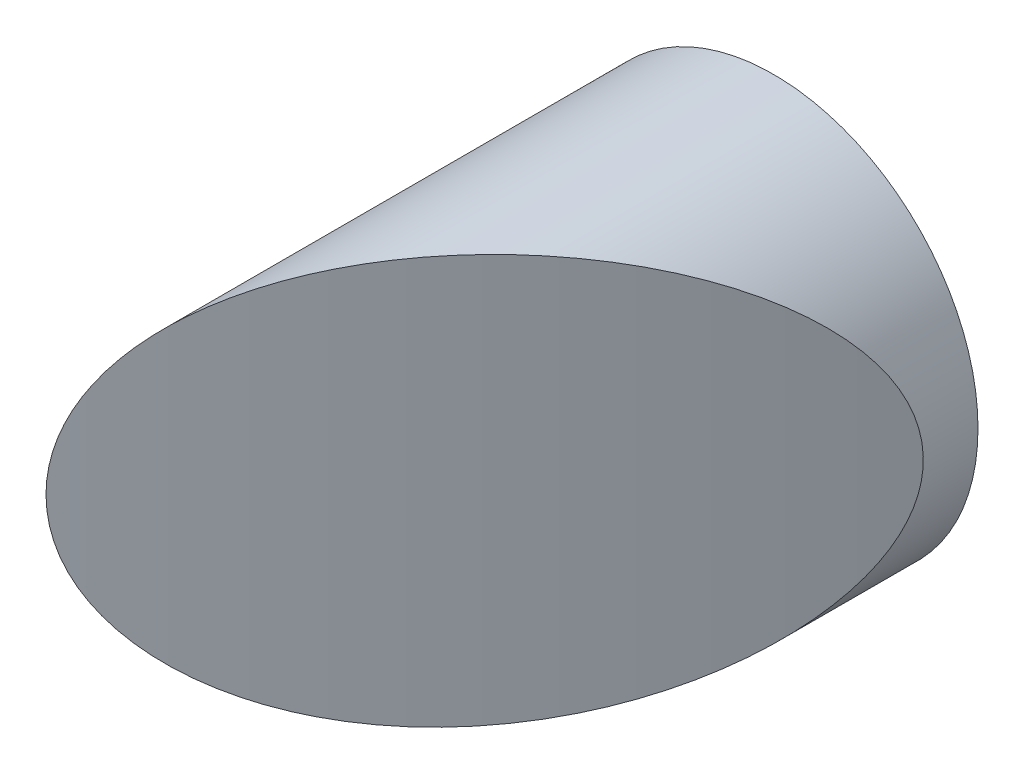
ISO-10303-21;
HEADER;
FILE_DESCRIPTION(('STEP AP214'),'2;1');
FILE_NAME('part.step','',(''),(''),'','','');
FILE_SCHEMA(('AUTOMOTIVE_DESIGN { 1 0 10303 214 1 1 1 1 }'));
ENDSEC;
DATA;
#1=APPLICATION_CONTEXT('core data for automotive mechanical design processes');
#2=APPLICATION_PROTOCOL_DEFINITION('international standard','automotive_design',2000,#1);
#3=PRODUCT_CONTEXT('',#1,'mechanical');
#4=PRODUCT('Part','Part','',(#3));
#5=PRODUCT_RELATED_PRODUCT_CATEGORY('part','',(#4));
#6=PRODUCT_DEFINITION_FORMATION('','',#4);
#7=PRODUCT_DEFINITION_CONTEXT('part definition',#1,'design');
#8=PRODUCT_DEFINITION('design','',#6,#7);
#9=PRODUCT_DEFINITION_SHAPE('','',#8);
#10=(LENGTH_UNIT() NAMED_UNIT(*) SI_UNIT(.MILLI.,.METRE.));
#11=(NAMED_UNIT(*) PLANE_ANGLE_UNIT() SI_UNIT($,.RADIAN.));
#12=(NAMED_UNIT(*) SI_UNIT($,.STERADIAN.) SOLID_ANGLE_UNIT());
#13=UNCERTAINTY_MEASURE_WITH_UNIT(LENGTH_MEASURE(1.E-05),#10,'distance_accuracy_value','');
#14=(GEOMETRIC_REPRESENTATION_CONTEXT(3) GLOBAL_UNCERTAINTY_ASSIGNED_CONTEXT((#13)) GLOBAL_UNIT_ASSIGNED_CONTEXT((#10,
#11,#12)) REPRESENTATION_CONTEXT('',''));
#15=CARTESIAN_POINT('',(0.,0.,0.));
#16=DIRECTION('',(0.,0.,1.));
#17=DIRECTION('',(1.,0.,0.));
#18=AXIS2_PLACEMENT_3D('',#15,#16,#17);
#19=CARTESIAN_POINT('',(0.,0.,16.5324447059872));
#20=DIRECTION('',(0.,0.,-1.));
#21=DIRECTION('',(-1.,0.,0.));
#22=AXIS2_PLACEMENT_3D('',#19,#20,#21);
#23=CYLINDRICAL_SURFACE('',#22,3.175);
#24=CARTESIAN_POINT('',(0.,0.,0.));
#25=DIRECTION('',(0.,0.,1.));
#26=DIRECTION('',(1.,0.,0.));
#27=AXIS2_PLACEMENT_3D('',#24,#25,#26);
#28=CIRCLE('',#27,3.175);
#29=CARTESIAN_POINT('',(3.175,0.,0.));
#30=VERTEX_POINT('',#29);
#31=EDGE_CURVE('E48',#30,#30,#28,.T.);
#32=ORIENTED_EDGE('',*,*,#31,.T.);
#33=EDGE_LOOP('',(#32));
#34=FACE_BOUND('',#33,.T.);
#35=CARTESIAN_POINT('',(-3.175,0.,8.13488065936193));
#36=CARTESIAN_POINT('',(-3.17499986722707,-0.0715730068806569,8.13488054740115));
#37=CARTESIAN_POINT('',(-3.17257360340069,-0.143147855133169,8.13260702879474));
#38=CARTESIAN_POINT('',(-3.1629288397228,-0.285698042896952,8.12356325786389));
#39=CARTESIAN_POINT('',(-3.15570825160663,-0.356673107511531,8.11679104604226));
#40=CARTESIAN_POINT('',(-3.12700616068544,-0.567982200195982,8.08984596120171));
#41=CARTESIAN_POINT('',(-3.09848453241673,-0.706622387315895,8.06304480035592));
#42=CARTESIAN_POINT('',(-3.02502232359064,-0.974199931915195,7.99373993311163));
#43=CARTESIAN_POINT('',(-2.98018083902979,-1.10319030202589,7.9513309818782));
#44=CARTESIAN_POINT('',(-2.8768184800484,-1.34998294556236,7.85307171451631));
#45=CARTESIAN_POINT('',(-2.81829499355136,-1.46778307657549,7.79721883170184));
#46=CARTESIAN_POINT('',(-2.66737195029389,-1.73097990812614,7.65229488138221));
#47=CARTESIAN_POINT('',(-2.57035113307727,-1.87111781256805,7.55849490311209));
#48=CARTESIAN_POINT('',(-2.36233359138278,-2.12777225757495,7.35538783190112));
#49=CARTESIAN_POINT('',(-2.25131043748003,-2.24424301138036,7.24605136303815));
#50=CARTESIAN_POINT('',(-1.97616311782616,-2.49437494105473,6.97213827431056));
#51=CARTESIAN_POINT('',(-1.80789573066071,-2.61774230342646,6.80236162891705));
#52=CARTESIAN_POINT('',(-1.46267791549881,-2.82522088822349,6.4483707870371));
#53=CARTESIAN_POINT('',(-1.28571401937889,-2.90926895568339,6.26413391482271));
#54=CARTESIAN_POINT('',(-0.984519094242021,-3.02133741469793,5.94530391846377));
#55=CARTESIAN_POINT('',(-0.861039703669985,-3.05865548129609,5.81313129688599));
#56=CARTESIAN_POINT('',(-0.61384585367852,-3.11768749799412,5.54546927010421));
#57=CARTESIAN_POINT('',(-0.490131323836339,-3.1393956311318,5.40997864789235));
#58=CARTESIAN_POINT('',(-0.243382539680292,-3.16809653627082,5.13658405488085));
#59=CARTESIAN_POINT('',(-0.120349273131409,-3.17507172013822,4.99867739753677));
#60=CARTESIAN_POINT('',(0.124086277069481,-3.17492718026705,4.72148050921972));
#61=CARTESIAN_POINT('',(0.245488762014007,-3.16780921248858,4.58219045276524));
#62=CARTESIAN_POINT('',(0.488626268301409,-3.13961356974157,4.29996764500132));
#63=CARTESIAN_POINT('',(0.610310906362056,-3.11823512858943,4.15702164842444));
#64=CARTESIAN_POINT('',(0.850656076498503,-3.06141498092922,3.87133533688631));
#65=CARTESIAN_POINT('',(0.969316087454629,-3.02597086821346,3.72859506131299));
#66=CARTESIAN_POINT('',(1.20278957752354,-2.9409761731048,3.44445669263854));
#67=CARTESIAN_POINT('',(1.3176073685194,-2.8914420399561,3.30305723196713));
#68=CARTESIAN_POINT('',(1.54276862130433,-2.77783914885199,3.02259223397563));
#69=CARTESIAN_POINT('',(1.65311396014525,-2.71377656440667,2.88352573220004));
#70=CARTESIAN_POINT('',(1.8303385244717,-2.59566392297699,2.65769455139543));
#71=CARTESIAN_POINT('',(1.89879548052806,-2.54607834987435,2.56981729448831));
#72=CARTESIAN_POINT('',(2.03311515760525,-2.44016058679313,2.39618369378295));
#73=CARTESIAN_POINT('',(2.09897845511244,-2.38382990740961,2.31042688027363));
#74=CARTESIAN_POINT('',(2.22765095803665,-2.26404895542093,2.14175312131978));
#75=CARTESIAN_POINT('',(2.29046262992069,-2.20060457442221,2.05883389898454));
#76=CARTESIAN_POINT('',(2.4125053486356,-2.06607940703275,1.89667966887424));
#77=CARTESIAN_POINT('',(2.47173757975678,-1.99500116822929,1.81744344457113));
#78=CARTESIAN_POINT('',(2.608272262201,-1.8151673399142,1.63368314111671));
#79=CARTESIAN_POINT('',(2.68358405061976,-1.70254682182259,1.53138604997791));
#80=CARTESIAN_POINT('',(2.82294759307393,-1.45982720669341,1.34069763977509));
#81=CARTESIAN_POINT('',(2.8870186814944,-1.32975881450927,1.25228247141813));
#82=CARTESIAN_POINT('',(2.98403377247629,-1.08994257147056,1.11764628324607));
#83=CARTESIAN_POINT('',(3.02068918969143,-0.984481942206491,1.06651320412644));
#84=CARTESIAN_POINT('',(3.08363218398155,-0.764735229103365,0.978440791276078));
#85=CARTESIAN_POINT('',(3.10992973409325,-0.650457761969382,0.941487805178574));
#86=CARTESIAN_POINT('',(3.14004445116164,-0.47370455124207,0.899099656128477));
#87=CARTESIAN_POINT('',(3.1485490689223,-0.413531971032662,0.887112988714139));
#88=CARTESIAN_POINT('',(3.16212817519136,-0.292054827226712,0.867962826644184));
#89=CARTESIAN_POINT('',(3.16720447008225,-0.230750877269689,0.860796792006162));
#90=CARTESIAN_POINT('',(3.17377522859064,-0.107592827149941,0.8515195396218));
#91=CARTESIAN_POINT('',(3.17527118822956,-0.0457389676113282,0.849406210633375));
#92=CARTESIAN_POINT('',(3.17464740015999,0.0778935818745432,0.850287088175791));
#93=CARTESIAN_POINT('',(3.17252804575421,0.139672279266892,0.853280739128599));
#94=CARTESIAN_POINT('',(3.16196850269324,0.305858732831619,0.86818846371527));
#95=CARTESIAN_POINT('',(3.15012959364657,0.409668946238106,0.884897740528806));
#96=CARTESIAN_POINT('',(3.11703836284877,0.612635245028987,0.931487183675592));
#97=CARTESIAN_POINT('',(3.09578088935658,0.711788750426931,0.961374558085857));
#98=CARTESIAN_POINT('',(3.03584086009487,0.939594935182246,1.04536177326787));
#99=CARTESIAN_POINT('',(2.99361827016963,1.06551107001611,1.10433222297869));
#100=CARTESIAN_POINT('',(2.89764629811336,1.30419401367023,1.23754576599341));
#101=CARTESIAN_POINT('',(2.84387122623139,1.41693063750414,1.31182288213858));
#102=CARTESIAN_POINT('',(2.74114251365993,1.60480927890498,1.45272423348193));
#103=CARTESIAN_POINT('',(2.69394717561522,1.68261805655608,1.51714937173559));
#104=CARTESIAN_POINT('',(2.5953612802138,1.83102906071582,1.65096385393353));
#105=CARTESIAN_POINT('',(2.54396847331496,1.90162737671694,1.72035585726559));
#106=CARTESIAN_POINT('',(2.43765304913199,2.03613176073106,1.86304741703707));
#107=CARTESIAN_POINT('',(2.38272498586074,2.10002708453402,1.93635297109556));
#108=CARTESIAN_POINT('',(2.26993928031329,2.22145590465268,2.08593707447237));
#109=CARTESIAN_POINT('',(2.21208069678673,2.27898733782363,2.16221657715513));
#110=CARTESIAN_POINT('',(2.05960607976222,2.41966937825275,2.3619428741689));
#111=CARTESIAN_POINT('',(1.96311296011317,2.49835451676908,2.48711538889664));
#112=CARTESIAN_POINT('',(1.76506589086385,2.64199395956975,2.74130734354324));
#113=CARTESIAN_POINT('',(1.66350915145129,2.70694058894901,2.87032888801365));
#114=CARTESIAN_POINT('',(1.45611824243213,2.82392054901982,3.13095951183938));
#115=CARTESIAN_POINT('',(1.35028022604789,2.8759419524724,3.26257086108633));
#116=CARTESIAN_POINT('',(1.13510341082587,2.9674618654324,3.52721139893676));
#117=CARTESIAN_POINT('',(1.025765247715,3.00696263499626,3.66024032717187));
#118=CARTESIAN_POINT('',(0.799702439785961,3.07499338482943,3.93224115941388));
#119=CARTESIAN_POINT('',(0.682857201052633,3.10302212201937,4.07123819842145));
#120=CARTESIAN_POINT('',(0.446553778525211,3.14573222099632,4.34909059591263));
#121=CARTESIAN_POINT('',(0.327095287119743,3.16041200269816,4.48794593568106));
#122=CARTESIAN_POINT('',(0.0862782439303756,3.17611877844454,4.76462960384645));
#123=CARTESIAN_POINT('',(-0.0350790111773201,3.17715471464029,4.90245854572749));
#124=CARTESIAN_POINT('',(-0.27904521347038,3.16507091769839,5.17635428412509));
#125=CARTESIAN_POINT('',(-0.401653898019134,3.15195409664937,5.31242143732056));
#126=CARTESIAN_POINT('',(-0.625742392879591,3.1144194155892,5.55828153297161));
#127=CARTESIAN_POINT('',(-0.727155628977433,3.09238766438286,5.66849635103423));
#128=CARTESIAN_POINT('',(-0.929659578800098,3.0376582874342,5.88654711482366));
#129=CARTESIAN_POINT('',(-1.03075019659904,3.00495774255744,5.99438240084528));
#130=CARTESIAN_POINT('',(-1.33226446975587,2.88997131845316,6.31307498762554));
#131=CARTESIAN_POINT('',(-1.53138334581604,2.79073135450771,6.5196150217153));
#132=CARTESIAN_POINT('',(-1.86203642939049,2.57690026224784,6.85690165729709));
#133=CARTESIAN_POINT('',(-1.9966835111157,2.47470627036192,6.99249570181842));
#134=CARTESIAN_POINT('',(-2.25476207414332,2.24204162201003,7.24955312971265));
#135=CARTESIAN_POINT('',(-2.37820938590844,2.11161178820551,7.3710365282993));
#136=CARTESIAN_POINT('',(-2.5809408351412,1.85463589090572,7.56868669331248));
#137=CARTESIAN_POINT('',(-2.66386089558732,1.7340571708272,7.64885713343532));
#138=CARTESIAN_POINT('',(-2.81513376429581,1.47578981211403,7.79423791063363));
#139=CARTESIAN_POINT('',(-2.88349928943951,1.33811627783692,7.85946131137821));
#140=CARTESIAN_POINT('',(-2.99177534337916,1.0710884993178,7.96231099677719));
#141=CARTESIAN_POINT('',(-3.0344895652895,0.943933334697603,8.002684175795));
#142=CARTESIAN_POINT('',(-3.10390486159647,0.681678631326287,8.0681421607715));
#143=CARTESIAN_POINT('',(-3.13064050091618,0.546596940038133,8.09325996912498));
#144=CARTESIAN_POINT('',(-3.15727485666883,0.341926689358095,8.118260617485));
#145=CARTESIAN_POINT('',(-3.16390741295749,0.27388366087397,8.12448098351967));
#146=CARTESIAN_POINT('',(-3.17277053505029,0.137227734138474,8.13279151485404));
#147=CARTESIAN_POINT('',(-3.17500012728509,0.0686147132194817,8.1348807666951));
#148=CARTESIAN_POINT('',(-3.175,0.,8.13488065936193));
#149=B_SPLINE_CURVE_WITH_KNOTS('',3,(#35,#36,#37,#38,#39,#40,#41,#42,#43,#44,#45,#46,#47,#48,
#49,#50,#51,#52,#53,#54,#55,#56,#57,#58,#59,#60,#61,#62,#63,#64,#65,#66,#67,#68,#69,#70,#71,#72,
#73,#74,#75,#76,#77,#78,#79,#80,#81,#82,#83,#84,#85,#86,#87,#88,#89,#90,#91,#92,#93,#94,#95,#96,
#97,#98,#99,#100,#101,#102,#103,#104,#105,#106,#107,#108,#109,#110,#111,#112,#113,#114,#115,
#116,#117,#118,#119,#120,#121,#122,#123,#124,#125,#126,#127,#128,#129,#130,#131,#132,#133,#134,
#135,#136,#137,#138,#139,#140,#141,#142,#143,#144,#145,#146,#147,#148),.UNSPECIFIED.,.T.,.F.,(4,
2,2,2,2,2,2,2,2,2,2,2,2,2,2,2,2,2,2,2,2,2,2,2,2,2,2,2,2,2,2,2,2,2,2,2,2,2,2,2,2,2,2,2,2,2,2,2,2,
2,2,2,2,2,2,2,4),(0.,0.214637454248836,0.429368459553509,0.859060190964376,1.28618516763049,
1.71339175483261,2.29384372834355,2.87540817874047,3.67803068170462,4.48193797419504,
5.03533423058406,5.58893660055156,6.14319948607738,6.69739331662629,7.26366156113234,
7.83002671866339,8.39573337396292,8.96120009496727,9.32679825152581,9.69231468343319,
10.0575305980379,10.4226250085144,10.930479556331,11.4374518253316,11.8046219322718,
12.1714376414186,12.3570139858206,12.5424924736465,12.7278934468682,12.9132742519786,
13.229120873165,13.545140468974,13.9786406361398,14.4131149634925,14.747170154938,
15.0814055657741,15.4161687890296,15.7510402248916,16.2799008026311,16.8090560482706,
17.3386977932748,17.8682438799592,18.4189422110128,18.9697057184802,19.5201082385833,
20.0703975287843,20.5241534308657,20.9780335913149,21.8837869300695,22.5318884725244,
23.1790591906006,23.6778326420611,24.1761684901458,24.5946908377851,25.0123045283961,
25.2180249898472,25.4237909344581),.UNSPECIFIED.);
#150=CARTESIAN_POINT('',(-3.175,0.,8.13488065936193));
#151=VERTEX_POINT('',#150);
#152=EDGE_CURVE('E10',#151,#151,#149,.T.);
#153=ORIENTED_EDGE('',*,*,#152,.F.);
#154=EDGE_LOOP('',(#153));
#155=FACE_BOUND('',#154,.T.);
#156=ADVANCED_FACE('F37',(#34,#155),#23,.T.);
#157=CARTESIAN_POINT('',(0.,0.,0.));
#158=DIRECTION('',(0.,0.,1.));
#159=DIRECTION('',(1.,0.,0.));
#160=AXIS2_PLACEMENT_3D('',#157,#158,#159);
#161=PLANE('',#160);
#162=ORIENTED_EDGE('',*,*,#31,.F.);
#163=EDGE_LOOP('',(#162));
#164=FACE_BOUND('',#163,.T.);
#165=ADVANCED_FACE('F56',(#164),#161,.F.);
#166=CARTESIAN_POINT('',(-36.0000000000003,-23.0572202538755,-26.8868179716298));
#167=DIRECTION('',(0.,1.,0.));
#168=DIRECTION('',(-1.,0.,0.));
#169=AXIS2_PLACEMENT_3D('',#166,#167,#168);
#170=CYLINDRICAL_SURFACE('',#169,48.0000000000003);
#171=ORIENTED_EDGE('',*,*,#152,.T.);
#172=EDGE_LOOP('',(#171));
#173=FACE_BOUND('',#172,.T.);
#174=ADVANCED_FACE('F58',(#173),#170,.T.);
#175=CLOSED_SHELL('',(#156,#165,#174));
#176=MANIFOLD_SOLID_BREP('B2',#175);
#177=ADVANCED_BREP_SHAPE_REPRESENTATION('',(#18,#176),#14);
#178=SHAPE_DEFINITION_REPRESENTATION(#9,#177);
ENDSEC;
END-ISO-10303-21;
